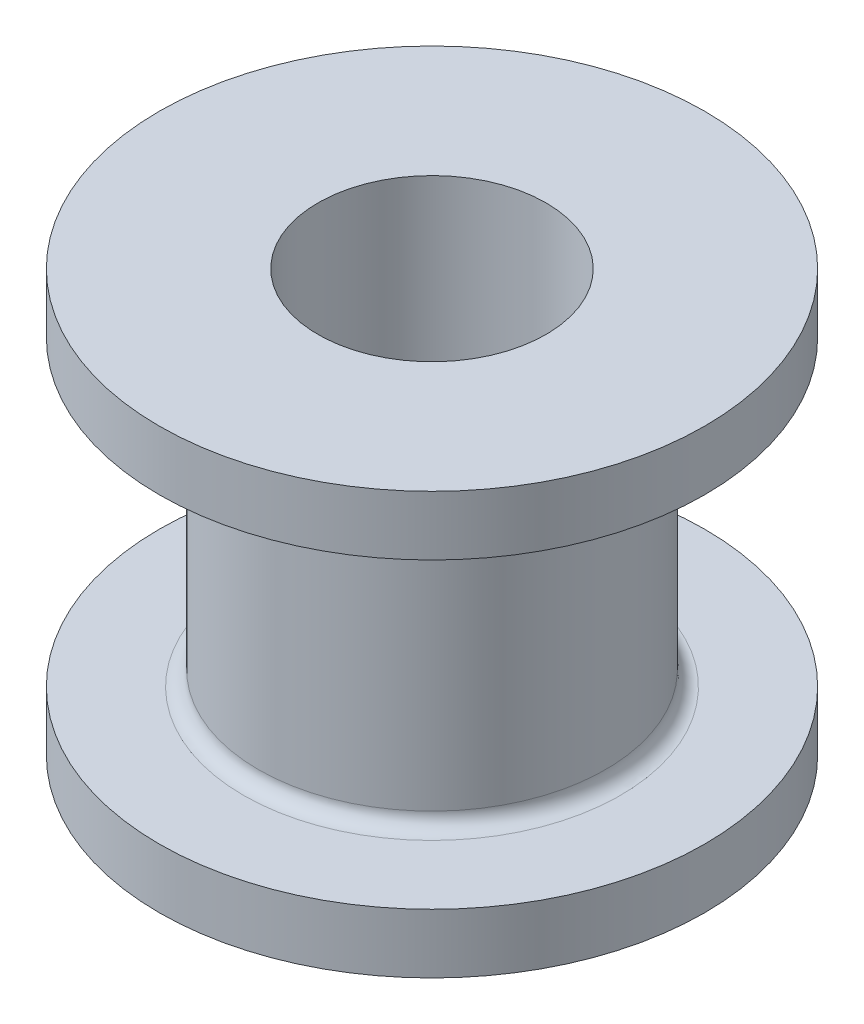
ISO-10303-21;
HEADER;
FILE_DESCRIPTION(('STEP AP214'),'2;1');
FILE_NAME('part.step','',(''),(''),'','','');
FILE_SCHEMA(('AUTOMOTIVE_DESIGN { 1 0 10303 214 1 1 1 1 }'));
ENDSEC;
DATA;
#1=APPLICATION_CONTEXT('core data for automotive mechanical design processes');
#2=APPLICATION_PROTOCOL_DEFINITION('international standard','automotive_design',2000,#1);
#3=PRODUCT_CONTEXT('',#1,'mechanical');
#4=PRODUCT('Part','Part','',(#3));
#5=PRODUCT_RELATED_PRODUCT_CATEGORY('part','',(#4));
#6=PRODUCT_DEFINITION_FORMATION('','',#4);
#7=PRODUCT_DEFINITION_CONTEXT('part definition',#1,'design');
#8=PRODUCT_DEFINITION('design','',#6,#7);
#9=PRODUCT_DEFINITION_SHAPE('','',#8);
#10=(LENGTH_UNIT() NAMED_UNIT(*) SI_UNIT(.MILLI.,.METRE.));
#11=(NAMED_UNIT(*) PLANE_ANGLE_UNIT() SI_UNIT($,.RADIAN.));
#12=(NAMED_UNIT(*) SI_UNIT($,.STERADIAN.) SOLID_ANGLE_UNIT());
#13=UNCERTAINTY_MEASURE_WITH_UNIT(LENGTH_MEASURE(1.E-05),#10,'distance_accuracy_value','');
#14=(GEOMETRIC_REPRESENTATION_CONTEXT(3) GLOBAL_UNCERTAINTY_ASSIGNED_CONTEXT((#13)) GLOBAL_UNIT_ASSIGNED_CONTEXT((#10,
#11,#12)) REPRESENTATION_CONTEXT('',''));
#15=CARTESIAN_POINT('',(0.,0.,0.));
#16=DIRECTION('',(0.,0.,1.));
#17=DIRECTION('',(1.,0.,0.));
#18=AXIS2_PLACEMENT_3D('',#15,#16,#17);
#19=CARTESIAN_POINT('',(0.,0.,0.));
#20=DIRECTION('',(0.,-1.,0.));
#21=DIRECTION('',(0.,0.,-1.));
#22=AXIS2_PLACEMENT_3D('',#19,#20,#21);
#23=CYLINDRICAL_SURFACE('',#22,55.);
#24=CARTESIAN_POINT('',(0.,85.,0.));
#25=DIRECTION('',(0.,-1.,0.));
#26=DIRECTION('',(0.,0.,-1.));
#27=AXIS2_PLACEMENT_3D('',#24,#25,#26);
#28=CIRCLE('',#27,55.);
#29=CARTESIAN_POINT('',(0.,85.,-55.));
#30=VERTEX_POINT('',#29);
#31=EDGE_CURVE('E87',#30,#30,#28,.T.);
#32=ORIENTED_EDGE('',*,*,#31,.T.);
#33=EDGE_LOOP('',(#32));
#34=FACE_BOUND('',#33,.T.);
#35=CARTESIAN_POINT('',(0.,73.,0.));
#36=DIRECTION('',(0.,-1.,0.));
#37=DIRECTION('',(0.,0.,-1.));
#38=AXIS2_PLACEMENT_3D('',#35,#36,#37);
#39=CIRCLE('',#38,55.);
#40=CARTESIAN_POINT('',(0.,73.,-55.));
#41=VERTEX_POINT('',#40);
#42=EDGE_CURVE('E67',#41,#41,#39,.T.);
#43=ORIENTED_EDGE('',*,*,#42,.F.);
#44=EDGE_LOOP('',(#43));
#45=FACE_BOUND('',#44,.T.);
#46=ADVANCED_FACE('F43',(#34,#45),#23,.T.);
#47=CARTESIAN_POINT('',(55.,73.,0.));
#48=DIRECTION('',(0.,-1.,0.));
#49=DIRECTION('',(0.,0.,-1.));
#50=AXIS2_PLACEMENT_3D('',#47,#48,#49);
#51=PLANE('',#50);
#52=CARTESIAN_POINT('',(0.,73.,0.));
#53=DIRECTION('',(0.,-1.,0.));
#54=DIRECTION('',(0.,0.,-1.));
#55=AXIS2_PLACEMENT_3D('',#52,#53,#54);
#56=CIRCLE('',#55,38.);
#57=CARTESIAN_POINT('',(0.,73.,-38.));
#58=VERTEX_POINT('',#57);
#59=EDGE_CURVE('E51',#58,#58,#56,.F.);
#60=ORIENTED_EDGE('',*,*,#59,.T.);
#61=EDGE_LOOP('',(#60));
#62=FACE_BOUND('',#61,.T.);
#63=ORIENTED_EDGE('',*,*,#42,.T.);
#64=EDGE_LOOP('',(#63));
#65=FACE_BOUND('',#64,.T.);
#66=ADVANCED_FACE('F110',(#62,#65),#51,.T.);
#67=CARTESIAN_POINT('',(0.,0.,0.));
#68=DIRECTION('',(0.,-1.,0.));
#69=DIRECTION('',(0.,0.,-1.));
#70=AXIS2_PLACEMENT_3D('',#67,#68,#69);
#71=CYLINDRICAL_SURFACE('',#70,35.);
#72=CARTESIAN_POINT('',(0.,70.,0.));
#73=DIRECTION('',(0.,-1.,0.));
#74=DIRECTION('',(0.,0.,-1.));
#75=AXIS2_PLACEMENT_3D('',#72,#73,#74);
#76=CIRCLE('',#75,35.);
#77=CARTESIAN_POINT('',(0.,70.,-35.));
#78=VERTEX_POINT('',#77);
#79=EDGE_CURVE('E56',#78,#78,#76,.T.);
#80=ORIENTED_EDGE('',*,*,#79,.T.);
#81=EDGE_LOOP('',(#80));
#82=FACE_BOUND('',#81,.T.);
#83=CARTESIAN_POINT('',(0.,15.,0.));
#84=DIRECTION('',(0.,1.,0.));
#85=DIRECTION('',(0.,0.,1.));
#86=AXIS2_PLACEMENT_3D('',#83,#84,#85);
#87=CIRCLE('',#86,35.);
#88=CARTESIAN_POINT('',(0.,15.,35.));
#89=VERTEX_POINT('',#88);
#90=EDGE_CURVE('E61',#89,#89,#87,.T.);
#91=ORIENTED_EDGE('',*,*,#90,.T.);
#92=EDGE_LOOP('',(#91));
#93=FACE_BOUND('',#92,.T.);
#94=ADVANCED_FACE('F115',(#82,#93),#71,.T.);
#95=CARTESIAN_POINT('',(35.,12.,0.));
#96=DIRECTION('',(0.,1.,0.));
#97=DIRECTION('',(0.,0.,1.));
#98=AXIS2_PLACEMENT_3D('',#95,#96,#97);
#99=PLANE('',#98);
#100=CARTESIAN_POINT('',(0.,12.,0.));
#101=DIRECTION('',(0.,1.,0.));
#102=DIRECTION('',(0.,0.,1.));
#103=AXIS2_PLACEMENT_3D('',#100,#101,#102);
#104=CIRCLE('',#103,38.);
#105=CARTESIAN_POINT('',(0.,12.,38.));
#106=VERTEX_POINT('',#105);
#107=EDGE_CURVE('E10',#106,#106,#104,.F.);
#108=ORIENTED_EDGE('',*,*,#107,.T.);
#109=EDGE_LOOP('',(#108));
#110=FACE_BOUND('',#109,.T.);
#111=CARTESIAN_POINT('',(0.,12.,0.));
#112=DIRECTION('',(0.,-1.,0.));
#113=DIRECTION('',(0.,0.,-1.));
#114=AXIS2_PLACEMENT_3D('',#111,#112,#113);
#115=CIRCLE('',#114,55.);
#116=CARTESIAN_POINT('',(0.,12.,-55.));
#117=VERTEX_POINT('',#116);
#118=EDGE_CURVE('E71',#117,#117,#115,.T.);
#119=ORIENTED_EDGE('',*,*,#118,.F.);
#120=EDGE_LOOP('',(#119));
#121=FACE_BOUND('',#120,.T.);
#122=ADVANCED_FACE('F120',(#110,#121),#99,.T.);
#123=CARTESIAN_POINT('',(0.,0.,0.));
#124=DIRECTION('',(0.,-1.,0.));
#125=DIRECTION('',(0.,0.,-1.));
#126=AXIS2_PLACEMENT_3D('',#123,#124,#125);
#127=CYLINDRICAL_SURFACE('',#126,55.);
#128=ORIENTED_EDGE('',*,*,#118,.T.);
#129=EDGE_LOOP('',(#128));
#130=FACE_BOUND('',#129,.T.);
#131=CARTESIAN_POINT('',(0.,0.,0.));
#132=DIRECTION('',(0.,-1.,0.));
#133=DIRECTION('',(0.,0.,-1.));
#134=AXIS2_PLACEMENT_3D('',#131,#132,#133);
#135=CIRCLE('',#134,55.);
#136=CARTESIAN_POINT('',(0.,0.,-55.));
#137=VERTEX_POINT('',#136);
#138=EDGE_CURVE('E75',#137,#137,#135,.T.);
#139=ORIENTED_EDGE('',*,*,#138,.F.);
#140=EDGE_LOOP('',(#139));
#141=FACE_BOUND('',#140,.T.);
#142=ADVANCED_FACE('F124',(#130,#141),#127,.T.);
#143=CARTESIAN_POINT('',(55.,0.,0.));
#144=DIRECTION('',(0.,-1.,0.));
#145=DIRECTION('',(0.,0.,-1.));
#146=AXIS2_PLACEMENT_3D('',#143,#144,#145);
#147=PLANE('',#146);
#148=ORIENTED_EDGE('',*,*,#138,.T.);
#149=EDGE_LOOP('',(#148));
#150=FACE_BOUND('',#149,.T.);
#151=CARTESIAN_POINT('',(0.,0.,0.));
#152=DIRECTION('',(0.,-1.,0.));
#153=DIRECTION('',(0.,0.,-1.));
#154=AXIS2_PLACEMENT_3D('',#151,#152,#153);
#155=CIRCLE('',#154,23.);
#156=CARTESIAN_POINT('',(0.,0.,-23.));
#157=VERTEX_POINT('',#156);
#158=EDGE_CURVE('E79',#157,#157,#155,.T.);
#159=ORIENTED_EDGE('',*,*,#158,.F.);
#160=EDGE_LOOP('',(#159));
#161=FACE_BOUND('',#160,.T.);
#162=ADVANCED_FACE('F106',(#150,#161),#147,.T.);
#163=CARTESIAN_POINT('',(0.,0.,0.));
#164=DIRECTION('',(0.,-1.,0.));
#165=DIRECTION('',(0.,0.,-1.));
#166=AXIS2_PLACEMENT_3D('',#163,#164,#165);
#167=CYLINDRICAL_SURFACE('',#166,23.);
#168=ORIENTED_EDGE('',*,*,#158,.T.);
#169=EDGE_LOOP('',(#168));
#170=FACE_BOUND('',#169,.T.);
#171=CARTESIAN_POINT('',(0.,85.,0.));
#172=DIRECTION('',(0.,-1.,0.));
#173=DIRECTION('',(0.,0.,-1.));
#174=AXIS2_PLACEMENT_3D('',#171,#172,#173);
#175=CIRCLE('',#174,23.);
#176=CARTESIAN_POINT('',(0.,85.,-23.));
#177=VERTEX_POINT('',#176);
#178=EDGE_CURVE('E83',#177,#177,#175,.T.);
#179=ORIENTED_EDGE('',*,*,#178,.F.);
#180=EDGE_LOOP('',(#179));
#181=FACE_BOUND('',#180,.T.);
#182=ADVANCED_FACE('F97',(#170,#181),#167,.F.);
#183=CARTESIAN_POINT('',(23.,85.,0.));
#184=DIRECTION('',(0.,1.,0.));
#185=DIRECTION('',(0.,0.,1.));
#186=AXIS2_PLACEMENT_3D('',#183,#184,#185);
#187=PLANE('',#186);
#188=ORIENTED_EDGE('',*,*,#178,.T.);
#189=EDGE_LOOP('',(#188));
#190=FACE_BOUND('',#189,.T.);
#191=ORIENTED_EDGE('',*,*,#31,.F.);
#192=EDGE_LOOP('',(#191));
#193=FACE_BOUND('',#192,.T.);
#194=ADVANCED_FACE('F94',(#190,#193),#187,.T.);
#195=CARTESIAN_POINT('',(0.,70.,0.));
#196=DIRECTION('',(0.,-1.,0.));
#197=DIRECTION('',(0.,0.,-1.));
#198=AXIS2_PLACEMENT_3D('',#195,#196,#197);
#199=TOROIDAL_SURFACE('',#198,38.,3.);
#200=ORIENTED_EDGE('',*,*,#59,.F.);
#201=EDGE_LOOP('',(#200));
#202=FACE_BOUND('',#201,.T.);
#203=ORIENTED_EDGE('',*,*,#79,.F.);
#204=EDGE_LOOP('',(#203));
#205=FACE_BOUND('',#204,.T.);
#206=ADVANCED_FACE('F96',(#202,#205),#199,.F.);
#207=CARTESIAN_POINT('',(0.,15.,0.));
#208=DIRECTION('',(0.,1.,0.));
#209=DIRECTION('',(0.,0.,1.));
#210=AXIS2_PLACEMENT_3D('',#207,#208,#209);
#211=TOROIDAL_SURFACE('',#210,38.,3.);
#212=ORIENTED_EDGE('',*,*,#90,.F.);
#213=EDGE_LOOP('',(#212));
#214=FACE_BOUND('',#213,.T.);
#215=ORIENTED_EDGE('',*,*,#107,.F.);
#216=EDGE_LOOP('',(#215));
#217=FACE_BOUND('',#216,.T.);
#218=ADVANCED_FACE('F45',(#214,#217),#211,.F.);
#219=CLOSED_SHELL('',(#46,#66,#94,#122,#142,#162,#182,#194,#206,#218));
#220=MANIFOLD_SOLID_BREP('B2',#219);
#221=ADVANCED_BREP_SHAPE_REPRESENTATION('',(#18,#220),#14);
#222=SHAPE_DEFINITION_REPRESENTATION(#9,#221);
ENDSEC;
END-ISO-10303-21;
